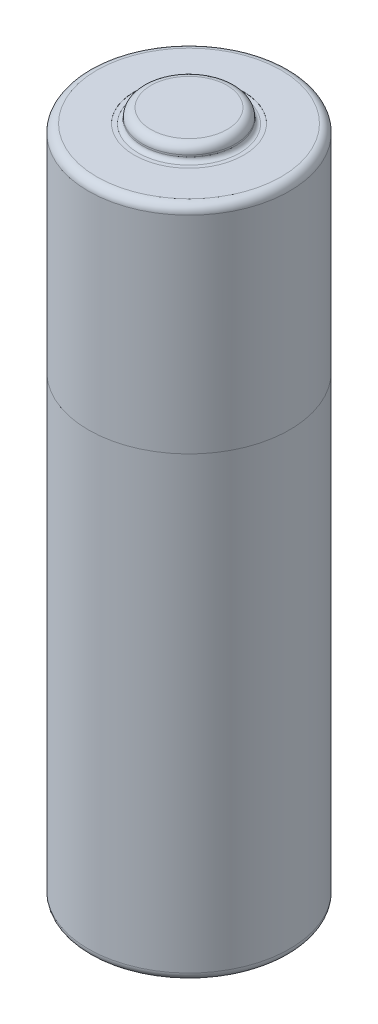
ISO-10303-21;
HEADER;
FILE_DESCRIPTION(('STEP AP214'),'2;1');
FILE_NAME('part.step','',(''),(''),'','','');
FILE_SCHEMA(('AUTOMOTIVE_DESIGN { 1 0 10303 214 1 1 1 1 }'));
ENDSEC;
DATA;
#1=APPLICATION_CONTEXT('core data for automotive mechanical design processes');
#2=APPLICATION_PROTOCOL_DEFINITION('international standard','automotive_design',2000,#1);
#3=PRODUCT_CONTEXT('',#1,'mechanical');
#4=PRODUCT('Part','Part','',(#3));
#5=PRODUCT_RELATED_PRODUCT_CATEGORY('part','',(#4));
#6=PRODUCT_DEFINITION_FORMATION('','',#4);
#7=PRODUCT_DEFINITION_CONTEXT('part definition',#1,'design');
#8=PRODUCT_DEFINITION('design','',#6,#7);
#9=PRODUCT_DEFINITION_SHAPE('','',#8);
#10=(LENGTH_UNIT() NAMED_UNIT(*) SI_UNIT(.MILLI.,.METRE.));
#11=(NAMED_UNIT(*) PLANE_ANGLE_UNIT() SI_UNIT($,.RADIAN.));
#12=(NAMED_UNIT(*) SI_UNIT($,.STERADIAN.) SOLID_ANGLE_UNIT());
#13=UNCERTAINTY_MEASURE_WITH_UNIT(LENGTH_MEASURE(1.E-05),#10,'distance_accuracy_value','');
#14=(GEOMETRIC_REPRESENTATION_CONTEXT(3) GLOBAL_UNCERTAINTY_ASSIGNED_CONTEXT((#13)) GLOBAL_UNIT_ASSIGNED_CONTEXT((#10,
#11,#12)) REPRESENTATION_CONTEXT('',''));
#15=CARTESIAN_POINT('',(0.,0.,0.));
#16=DIRECTION('',(0.,0.,1.));
#17=DIRECTION('',(1.,0.,0.));
#18=AXIS2_PLACEMENT_3D('',#15,#16,#17);
#19=CARTESIAN_POINT('',(0.,49.2500000000012,0.));
#20=DIRECTION('',(0.,-1.,0.));
#21=DIRECTION('',(1.,0.,0.));
#22=AXIS2_PLACEMENT_3D('',#19,#20,#21);
#23=PLANE('',#22);
#24=CARTESIAN_POINT('',(0.,49.2500000000012,2.9316826744008E-13));
#25=DIRECTION('',(0.,-1.,0.));
#26=DIRECTION('',(0.,0.,1.));
#27=AXIS2_PLACEMENT_3D('',#24,#25,#26);
#28=CIRCLE('',#27,2.74999999999971);
#29=CARTESIAN_POINT('',(0.,49.2500000000012,2.7500000000002));
#30=VERTEX_POINT('',#29);
#31=CARTESIAN_POINT('',(0.,49.2500000000012,-2.74999999999985));
#32=VERTEX_POINT('',#31);
#33=EDGE_CURVE('E112',#30,#32,#28,.T.);
#34=ORIENTED_EDGE('',*,*,#33,.F.);
#35=CARTESIAN_POINT('',(0.,49.2500000000012,2.9316826744008E-13));
#36=DIRECTION('',(0.,-1.,0.));
#37=DIRECTION('',(0.,0.,-1.));
#38=AXIS2_PLACEMENT_3D('',#35,#36,#37);
#39=CIRCLE('',#38,2.7500000000003);
#40=EDGE_CURVE('E116',#32,#30,#39,.T.);
#41=ORIENTED_EDGE('',*,*,#40,.F.);
#42=EDGE_LOOP('',(#34,#41));
#43=FACE_BOUND('',#42,.T.);
#44=ADVANCED_FACE('F24',(#43),#23,.F.);
#45=CARTESIAN_POINT('',(0.,48.6500000000012,2.9316826744008E-13));
#46=DIRECTION('',(0.,1.,0.));
#47=DIRECTION('',(0.,0.,1.));
#48=AXIS2_PLACEMENT_3D('',#45,#46,#47);
#49=TOROIDAL_SURFACE('',#48,2.75,0.6);
#50=ORIENTED_EDGE('',*,*,#33,.T.);
#51=ORIENTED_EDGE('',*,*,#40,.T.);
#52=EDGE_LOOP('',(#50,#51));
#53=FACE_BOUND('',#52,.T.);
#54=CARTESIAN_POINT('',(0.,48.6500000000012,0.));
#55=DIRECTION('',(0.,1.,0.));
#56=DIRECTION('',(-1.,0.,0.));
#57=AXIS2_PLACEMENT_3D('',#54,#55,#56);
#58=CIRCLE('',#57,3.35);
#59=CARTESIAN_POINT('',(-3.35000000000003,48.6500000000012,0.));
#60=VERTEX_POINT('',#59);
#61=EDGE_CURVE('E125',#60,#60,#58,.F.);
#62=ORIENTED_EDGE('',*,*,#61,.F.);
#63=EDGE_LOOP('',(#62));
#64=FACE_BOUND('',#63,.T.);
#65=ADVANCED_FACE('F122',(#53,#64),#49,.T.);
#66=CARTESIAN_POINT('',(0.,-1.00000000000008,2.9316826744008E-13));
#67=DIRECTION('',(0.,1.,0.));
#68=DIRECTION('',(-1.,0.,0.));
#69=AXIS2_PLACEMENT_3D('',#66,#67,#68);
#70=PLANE('',#69);
#71=CARTESIAN_POINT('',(0.,-1.00000000000007,2.89698820488127E-13));
#72=DIRECTION('',(0.,1.,0.));
#73=DIRECTION('',(0.,0.,-1.));
#74=AXIS2_PLACEMENT_3D('',#71,#72,#73);
#75=CIRCLE('',#74,3.95);
#76=CARTESIAN_POINT('',(0.,-1.00000000000007,-3.94999999999971));
#77=VERTEX_POINT('',#76);
#78=CARTESIAN_POINT('',(0.,-1.00000000000007,3.95000000000029));
#79=VERTEX_POINT('',#78);
#80=EDGE_CURVE('E150',#77,#79,#75,.T.);
#81=ORIENTED_EDGE('',*,*,#80,.F.);
#82=CARTESIAN_POINT('',(0.,-1.00000000000007,2.89698820488127E-13));
#83=DIRECTION('',(0.,1.,0.));
#84=DIRECTION('',(0.,0.,1.));
#85=AXIS2_PLACEMENT_3D('',#82,#83,#84);
#86=CIRCLE('',#85,3.95);
#87=EDGE_CURVE('E183',#79,#77,#86,.T.);
#88=ORIENTED_EDGE('',*,*,#87,.F.);
#89=EDGE_LOOP('',(#81,#88));
#90=FACE_BOUND('',#89,.T.);
#91=ADVANCED_FACE('F141',(#90),#70,.F.);
#92=CARTESIAN_POINT('',(0.,7.58183489262092,0.));
#93=DIRECTION('',(0.,1.,0.));
#94=DIRECTION('',(-1.,0.,0.));
#95=AXIS2_PLACEMENT_3D('',#92,#93,#94);
#96=CYLINDRICAL_SURFACE('',#95,3.35);
#97=ORIENTED_EDGE('',*,*,#61,.T.);
#98=EDGE_LOOP('',(#97));
#99=FACE_BOUND('',#98,.T.);
#100=CARTESIAN_POINT('',(0.,48.5300000000012,2.9316826744008E-13));
#101=DIRECTION('',(0.,1.,0.));
#102=DIRECTION('',(0.,0.,1.));
#103=AXIS2_PLACEMENT_3D('',#100,#101,#102);
#104=CIRCLE('',#103,3.35);
#105=CARTESIAN_POINT('',(0.,48.5300000000012,3.35000000000029));
#106=VERTEX_POINT('',#105);
#107=EDGE_CURVE('E179',#106,#106,#104,.T.);
#108=ORIENTED_EDGE('',*,*,#107,.T.);
#109=EDGE_LOOP('',(#108));
#110=FACE_BOUND('',#109,.T.);
#111=ADVANCED_FACE('F168',(#99,#110),#96,.T.);
#112=CARTESIAN_POINT('',(0.,-0.700000000000069,2.89698820488127E-13));
#113=DIRECTION('',(0.,1.,0.));
#114=DIRECTION('',(0.,0.,1.));
#115=AXIS2_PLACEMENT_3D('',#112,#113,#114);
#116=TOROIDAL_SURFACE('',#115,3.95,0.3);
#117=CARTESIAN_POINT('',(0.,-0.700000000000069,0.));
#118=DIRECTION('',(0.,1.,0.));
#119=DIRECTION('',(-1.,0.,0.));
#120=AXIS2_PLACEMENT_3D('',#117,#118,#119);
#121=CIRCLE('',#120,4.25);
#122=CARTESIAN_POINT('',(-4.25000000000003,-0.700000000000069,0.));
#123=VERTEX_POINT('',#122);
#124=EDGE_CURVE('E177',#123,#123,#121,.T.);
#125=ORIENTED_EDGE('',*,*,#124,.F.);
#126=EDGE_LOOP('',(#125));
#127=FACE_BOUND('',#126,.T.);
#128=ORIENTED_EDGE('',*,*,#87,.T.);
#129=ORIENTED_EDGE('',*,*,#80,.T.);
#130=EDGE_LOOP('',(#128,#129));
#131=FACE_BOUND('',#130,.T.);
#132=ADVANCED_FACE('F157',(#127,#131),#116,.T.);
#133=CARTESIAN_POINT('',(0.,48.5300000000012,2.9316826744008E-13));
#134=DIRECTION('',(0.,1.,0.));
#135=DIRECTION('',(0.,0.,1.));
#136=AXIS2_PLACEMENT_3D('',#133,#134,#135);
#137=TOROIDAL_SURFACE('',#136,3.65,0.3);
#138=ORIENTED_EDGE('',*,*,#107,.F.);
#139=EDGE_LOOP('',(#138));
#140=FACE_BOUND('',#139,.T.);
#141=CARTESIAN_POINT('',(0.,48.2300000000012,2.9316826744008E-13));
#142=DIRECTION('',(0.,1.,0.));
#143=DIRECTION('',(0.,0.,-1.));
#144=AXIS2_PLACEMENT_3D('',#141,#142,#143);
#145=CIRCLE('',#144,3.65);
#146=CARTESIAN_POINT('',(0.,48.2300000000011,-3.64999999999971));
#147=VERTEX_POINT('',#146);
#148=CARTESIAN_POINT('',(0.,48.2300000000011,3.65000000000029));
#149=VERTEX_POINT('',#148);
#150=EDGE_CURVE('E226',#147,#149,#145,.T.);
#151=ORIENTED_EDGE('',*,*,#150,.T.);
#152=CARTESIAN_POINT('',(0.,48.2300000000012,2.9316826744008E-13));
#153=DIRECTION('',(0.,1.,0.));
#154=DIRECTION('',(0.,0.,1.));
#155=AXIS2_PLACEMENT_3D('',#152,#153,#154);
#156=CIRCLE('',#155,3.65);
#157=EDGE_CURVE('E280',#149,#147,#156,.T.);
#158=ORIENTED_EDGE('',*,*,#157,.T.);
#159=EDGE_LOOP('',(#151,#158));
#160=FACE_BOUND('',#159,.T.);
#161=ADVANCED_FACE('F167',(#140,#160),#137,.F.);
#162=CARTESIAN_POINT('',(0.,7.58183489262092,0.));
#163=DIRECTION('',(0.,1.,0.));
#164=DIRECTION('',(-1.,0.,0.));
#165=AXIS2_PLACEMENT_3D('',#162,#163,#164);
#166=CYLINDRICAL_SURFACE('',#165,4.25);
#167=CARTESIAN_POINT('',(0.,-0.540000000000006,2.89698820488127E-13));
#168=DIRECTION('',(0.,1.,0.));
#169=DIRECTION('',(0.,0.,1.));
#170=AXIS2_PLACEMENT_3D('',#167,#168,#169);
#171=CIRCLE('',#170,4.25);
#172=CARTESIAN_POINT('',(0.,-0.540000000000006,4.25000000000029));
#173=VERTEX_POINT('',#172);
#174=EDGE_CURVE('E317',#173,#173,#171,.F.);
#175=ORIENTED_EDGE('',*,*,#174,.T.);
#176=EDGE_LOOP('',(#175));
#177=FACE_BOUND('',#176,.T.);
#178=ORIENTED_EDGE('',*,*,#124,.T.);
#179=EDGE_LOOP('',(#178));
#180=FACE_BOUND('',#179,.T.);
#181=ADVANCED_FACE('F346',(#177,#180),#166,.T.);
#182=CARTESIAN_POINT('',(3.65,48.2300000000009,1.59594559789866E-13));
#183=DIRECTION('',(0.,-1.,0.));
#184=DIRECTION('',(1.,0.,0.));
#185=AXIS2_PLACEMENT_3D('',#182,#183,#184);
#186=PLANE('',#185);
#187=CARTESIAN_POINT('',(0.,48.2300000000009,-3.94999999999972));
#188=CARTESIAN_POINT('',(-0.753704577886863,48.2300000000009,-3.94999999999972));
#189=CARTESIAN_POINT('',(-1.45397410276946,48.2300000000009,-3.67266378919631));
#190=CARTESIAN_POINT('',(-1.8267741380189,48.2300000000009,-3.52501928163218));
#191=CARTESIAN_POINT('',(-2.16147852587137,48.2300000000009,-3.30613226931338));
#192=CARTESIAN_POINT('',(-2.50425783462435,48.2300000000009,-3.08196449171402));
#193=CARTESIAN_POINT('',(-2.79307178568692,48.2300000000009,-2.79307178568657));
#194=CARTESIAN_POINT('',(-3.08264307283529,48.2300000000009,-2.50342153705983));
#195=CARTESIAN_POINT('',(-3.30613226931373,48.2300000000009,-2.16147852587102));
#196=CARTESIAN_POINT('',(-3.52550285001301,48.2300000000009,-1.82583708050126));
#197=CARTESIAN_POINT('',(-3.67266378919665,48.2300000000009,-1.4539741027691));
#198=CARTESIAN_POINT('',(-3.95010109244425,48.2300000000009,-0.752914009704023));
#199=CARTESIAN_POINT('',(-3.95000000000005,48.2300000000009,2.98372437868011E-13));
#200=CARTESIAN_POINT('',(-3.94989876708713,48.2300000000009,0.753960189382939));
#201=CARTESIAN_POINT('',(-3.67266378919664,48.2300000000009,1.4539741027697));
#202=CARTESIAN_POINT('',(-3.52501928163427,48.2300000000009,1.82677413801496));
#203=CARTESIAN_POINT('',(-3.30613226931371,48.2300000000009,2.16147852587161));
#204=CARTESIAN_POINT('',(-3.0819644917163,48.2300000000009,2.50425783462313));
#205=CARTESIAN_POINT('',(-2.7930717856869,48.2300000000009,2.79307178568716));
#206=CARTESIAN_POINT('',(-2.50342153705905,48.2300000000009,3.08264307283614));
#207=CARTESIAN_POINT('',(-2.16147852587134,48.2300000000009,3.30613226931397));
#208=CARTESIAN_POINT('',(-1.82583708050135,48.2300000000009,3.52550285001351));
#209=CARTESIAN_POINT('',(-1.45397410276942,48.2300000000009,3.67266378919689));
#210=CARTESIAN_POINT('',(-0.753169461575054,48.2300000000009,3.95000000000028));
#211=CARTESIAN_POINT('',(0.,48.2300000000009,3.95000000000028));
#212=B_SPLINE_CURVE_WITH_KNOTS('',2,(#187,#188,#189,#190,#191,#192,#193,#194,#195,#196,#197,
#198,#199,#200,#201,#202,#203,#204,#205,#206,#207,#208,#209,#210,#211),.UNSPECIFIED.,.F.,.F.,(3,
2,2,2,2,2,2,2,2,2,2,2,3),(0.,0.125,0.1875,0.25,0.3125,0.375,0.5,0.625,0.6875,0.75,0.8125,0.875,
1.),.UNSPECIFIED.);
#213=CARTESIAN_POINT('',(0.,48.2300000000011,-3.94999999999989));
#214=VERTEX_POINT('',#213);
#215=CARTESIAN_POINT('',(0.,48.2300000000011,3.95000000000011));
#216=VERTEX_POINT('',#215);
#217=EDGE_CURVE('E292',#214,#216,#212,.T.);
#218=ORIENTED_EDGE('',*,*,#217,.T.);
#219=CARTESIAN_POINT('',(0.,48.2300000000009,3.95000000000028));
#220=CARTESIAN_POINT('',(0.753704577886354,48.2300000000009,3.95000000000028));
#221=CARTESIAN_POINT('',(1.45397410276937,48.2300000000009,3.67266378919688));
#222=CARTESIAN_POINT('',(1.82677413801696,48.2300000000009,3.52501928163357));
#223=CARTESIAN_POINT('',(2.16147852587129,48.2300000000009,3.30613226931394));
#224=CARTESIAN_POINT('',(2.50425783462454,48.2300000000009,3.0819644917148));
#225=CARTESIAN_POINT('',(2.79307178568683,48.2300000000009,2.79307178568713));
#226=CARTESIAN_POINT('',(3.08264307283677,48.2300000000009,2.50342153705833));
#227=CARTESIAN_POINT('',(3.30613226931364,48.2300000000009,2.16147852587158));
#228=CARTESIAN_POINT('',(3.52550285001381,48.2300000000009,1.82583708050013));
#229=CARTESIAN_POINT('',(3.67266378919656,48.2300000000009,1.45397410276966));
#230=CARTESIAN_POINT('',(3.95010109244539,48.2300000000009,0.752914009700439));
#231=CARTESIAN_POINT('',(3.94999999999996,48.2300000000009,2.65412691824451E-13));
#232=CARTESIAN_POINT('',(3.94989876708581,48.2300000000009,-0.753960189384605));
#233=CARTESIAN_POINT('',(3.67266378919655,48.2300000000009,-1.45397410276913));
#234=CARTESIAN_POINT('',(3.52501928163398,48.2300000000009,-1.82677413801535));
#235=CARTESIAN_POINT('',(3.30613226931362,48.2300000000009,-2.16147852587104));
#236=CARTESIAN_POINT('',(3.0819644917168,48.2300000000009,-2.50425783462099));
#237=CARTESIAN_POINT('',(2.79307178568681,48.2300000000009,-2.79307178568659));
#238=CARTESIAN_POINT('',(2.5034215370607,48.2300000000009,-3.08264307283482));
#239=CARTESIAN_POINT('',(2.16147852587126,48.2300000000009,-3.3061322693134));
#240=CARTESIAN_POINT('',(1.82583708050071,48.2300000000009,-3.52550285001292));
#241=CARTESIAN_POINT('',(1.45397410276934,48.2300000000009,-3.67266378919632));
#242=CARTESIAN_POINT('',(0.753169461576079,48.2300000000009,-3.94999999999972));
#243=CARTESIAN_POINT('',(0.,48.2300000000009,-3.94999999999972));
#244=B_SPLINE_CURVE_WITH_KNOTS('',2,(#219,#220,#221,#222,#223,#224,#225,#226,#227,#228,#229,
#230,#231,#232,#233,#234,#235,#236,#237,#238,#239,#240,#241,#242,#243),.UNSPECIFIED.,.F.,.F.,(3,
2,2,2,2,2,2,2,2,2,2,2,3),(0.,0.125,0.1875,0.25,0.3125,0.375,0.5,0.625,0.6875,0.75,0.8125,0.875,
1.),.UNSPECIFIED.);
#245=EDGE_CURVE('E303',#216,#214,#244,.T.);
#246=ORIENTED_EDGE('',*,*,#245,.T.);
#247=EDGE_LOOP('',(#218,#246));
#248=FACE_BOUND('',#247,.T.);
#249=ORIENTED_EDGE('',*,*,#150,.F.);
#250=ORIENTED_EDGE('',*,*,#157,.F.);
#251=EDGE_LOOP('',(#249,#250));
#252=FACE_BOUND('',#251,.T.);
#253=ADVANCED_FACE('F245',(#248,#252),#186,.F.);
#254=CARTESIAN_POINT('',(0.,-0.540000000000006,2.89698820488127E-13));
#255=DIRECTION('',(0.,1.,0.));
#256=DIRECTION('',(0.,0.,1.));
#257=AXIS2_PLACEMENT_3D('',#254,#255,#256);
#258=TOROIDAL_SURFACE('',#257,4.55,0.3);
#259=CARTESIAN_POINT('',(0.,-0.240000000000006,2.89698820488127E-13));
#260=DIRECTION('',(0.,-1.,0.));
#261=DIRECTION('',(0.,0.,-1.));
#262=AXIS2_PLACEMENT_3D('',#259,#260,#261);
#263=CIRCLE('',#262,4.54999999999993);
#264=CARTESIAN_POINT('',(0.,-0.240000000000019,-4.54999999999975));
#265=VERTEX_POINT('',#264);
#266=CARTESIAN_POINT('',(0.,-0.240000000000019,4.55000000000022));
#267=VERTEX_POINT('',#266);
#268=EDGE_CURVE('E259',#265,#267,#263,.T.);
#269=ORIENTED_EDGE('',*,*,#268,.T.);
#270=CARTESIAN_POINT('',(0.,-0.240000000000006,2.89698820488127E-13));
#271=DIRECTION('',(0.,-1.,0.));
#272=DIRECTION('',(0.,0.,1.));
#273=AXIS2_PLACEMENT_3D('',#270,#271,#272);
#274=CIRCLE('',#273,4.55000000000007);
#275=EDGE_CURVE('E505',#267,#265,#274,.T.);
#276=ORIENTED_EDGE('',*,*,#275,.T.);
#277=EDGE_LOOP('',(#269,#276));
#278=FACE_BOUND('',#277,.T.);
#279=ORIENTED_EDGE('',*,*,#174,.F.);
#280=EDGE_LOOP('',(#279));
#281=FACE_BOUND('',#280,.T.);
#282=ADVANCED_FACE('F233',(#278,#281),#258,.F.);
#283=CARTESIAN_POINT('',(0.,7.58183489262092,0.));
#284=DIRECTION('',(0.,1.,0.));
#285=DIRECTION('',(-1.,0.,0.));
#286=AXIS2_PLACEMENT_3D('',#283,#284,#285);
#287=CYLINDRICAL_SURFACE('',#286,3.95);
#288=ORIENTED_EDGE('',*,*,#245,.F.);
#289=ORIENTED_EDGE('',*,*,#217,.F.);
#290=EDGE_LOOP('',(#288,#289));
#291=FACE_BOUND('',#290,.T.);
#292=CARTESIAN_POINT('',(0.,48.2500000000012,0.));
#293=DIRECTION('',(0.,1.,0.));
#294=DIRECTION('',(0.,0.,-1.));
#295=AXIS2_PLACEMENT_3D('',#292,#293,#294);
#296=CIRCLE('',#295,3.95);
#297=CARTESIAN_POINT('',(0.,48.2500000000011,-3.94999999999989));
#298=VERTEX_POINT('',#297);
#299=CARTESIAN_POINT('',(0.,48.2500000000011,3.95000000000011));
#300=VERTEX_POINT('',#299);
#301=EDGE_CURVE('E487',#298,#300,#296,.T.);
#302=ORIENTED_EDGE('',*,*,#301,.T.);
#303=CARTESIAN_POINT('',(0.,48.2500000000012,0.));
#304=DIRECTION('',(0.,1.,0.));
#305=DIRECTION('',(0.,0.,1.));
#306=AXIS2_PLACEMENT_3D('',#303,#304,#305);
#307=CIRCLE('',#306,3.95);
#308=EDGE_CURVE('E506',#300,#298,#307,.T.);
#309=ORIENTED_EDGE('',*,*,#308,.T.);
#310=EDGE_LOOP('',(#302,#309));
#311=FACE_BOUND('',#310,.T.);
#312=ADVANCED_FACE('F244',(#291,#311),#287,.F.);
#313=CARTESIAN_POINT('',(4.55,-0.240000000000039,-1.21430643318376E-13));
#314=DIRECTION('',(0.,1.,0.));
#315=DIRECTION('',(-1.,0.,0.));
#316=AXIS2_PLACEMENT_3D('',#313,#314,#315);
#317=PLANE('',#316);
#318=ORIENTED_EDGE('',*,*,#275,.F.);
#319=ORIENTED_EDGE('',*,*,#268,.F.);
#320=EDGE_LOOP('',(#318,#319));
#321=FACE_BOUND('',#320,.T.);
#322=CARTESIAN_POINT('',(0.,-0.240000000000039,6.29770850189359));
#323=CARTESIAN_POINT('',(-0.578064736426032,-0.240000000000039,6.29770850189359));
#324=CARTESIAN_POINT('',(-1.14595026220642,-0.240000000000039,6.19257057863467));
#325=CARTESIAN_POINT('',(-1.74895183396519,-0.240000000000039,6.08093129554244));
#326=CARTESIAN_POINT('',(-2.31815318190981,-0.240000000000039,5.85553568856208));
#327=CARTESIAN_POINT('',(-2.91225093025682,-0.240000000000039,5.62028146248218));
#328=CARTESIAN_POINT('',(-3.44616751621266,-0.240000000000039,5.2711537470485));
#329=CARTESIAN_POINT('',(-3.99243147882217,-0.240000000000039,4.91395208988666));
#330=CARTESIAN_POINT('',(-4.45315238762509,-0.240000000000039,4.45315238762516));
#331=CARTESIAN_POINT('',(-4.9146306710089,-0.240000000000039,3.99159518125498));
#332=CARTESIAN_POINT('',(-5.27115374704844,-0.240000000000039,3.44616751621274));
#333=CARTESIAN_POINT('',(-5.62076503086097,-0.240000000000039,2.91131387273878));
#334=CARTESIAN_POINT('',(-5.85553568856203,-0.240000000000039,2.3181531819099));
#335=CARTESIAN_POINT('',(-6.08122265092494,-0.240000000000039,1.74794293580362));
#336=CARTESIAN_POINT('',(-6.19257057863465,-0.240000000000039,1.14595026220652));
#337=CARTESIAN_POINT('',(-6.29775711538334,-0.240000000000039,0.577268601162514));
#338=CARTESIAN_POINT('',(-6.29770850189358,-0.240000000000039,0.));
#339=CARTESIAN_POINT('',(-6.29765979920589,-0.240000000000039,-0.578327796136489));
#340=CARTESIAN_POINT('',(-6.19257057863467,-0.240000000000039,-1.14595026220642));
#341=CARTESIAN_POINT('',(-6.08093129554121,-0.240000000000039,-1.74895183396933));
#342=CARTESIAN_POINT('',(-5.85553568856208,-0.240000000000039,-2.3181531819098));
#343=CARTESIAN_POINT('',(-5.62028146248187,-0.240000000000039,-2.91225093025653));
#344=CARTESIAN_POINT('',(-5.2711537470485,-0.240000000000039,-3.44616751621265));
#345=CARTESIAN_POINT('',(-4.91395208989014,-0.240000000000039,-3.99243147881765));
#346=CARTESIAN_POINT('',(-4.45315238762517,-0.240000000000039,-4.45315238762509));
#347=CARTESIAN_POINT('',(-3.99159518125728,-0.240000000000039,-4.91463067100765));
#348=CARTESIAN_POINT('',(-3.44616751621276,-0.240000000000039,-5.27115374704843));
#349=CARTESIAN_POINT('',(-2.91131387273083,-0.240000000000039,-5.62076503086594));
#350=CARTESIAN_POINT('',(-2.31815318190992,-0.240000000000039,-5.85553568856204));
#351=CARTESIAN_POINT('',(-1.74794293579301,-0.240000000000039,-6.08122265092742));
#352=CARTESIAN_POINT('',(-1.14595026220654,-0.240000000000039,-6.19257057863466));
#353=CARTESIAN_POINT('',(-0.577531425671142,-0.240000000000039,-6.29770850189359));
#354=CARTESIAN_POINT('',(0.,-0.240000000000039,-6.29770850189359));
#355=B_SPLINE_CURVE_WITH_KNOTS('',2,(#322,#323,#324,#325,#326,#327,#328,#329,#330,#331,#332,
#333,#334,#335,#336,#337,#338,#339,#340,#341,#342,#343,#344,#345,#346,#347,#348,#349,#350,#351,
#352,#353,#354),.UNSPECIFIED.,.F.,.F.,(3,2,2,2,2,2,2,2,2,2,2,2,2,2,2,2,3),(0.,0.0625,0.125,
0.1875,0.25,0.3125,0.375,0.4375,0.5,0.5625,0.625,0.6875,0.75,0.8125,0.875,0.9375,1.),.UNSPECIFIED.);
#356=CARTESIAN_POINT('',(0.,-0.240000000000013,6.29770850189358));
#357=VERTEX_POINT('',#356);
#358=CARTESIAN_POINT('',(0.,-0.240000000000013,-6.2977085018936));
#359=VERTEX_POINT('',#358);
#360=EDGE_CURVE('E462',#357,#359,#355,.T.);
#361=ORIENTED_EDGE('',*,*,#360,.T.);
#362=CARTESIAN_POINT('',(0.,-0.240000000000039,-6.29770850189359));
#363=CARTESIAN_POINT('',(0.578064736425724,-0.240000000000039,-6.29770850189359));
#364=CARTESIAN_POINT('',(1.1459502622064,-0.240000000000039,-6.19257057863469));
#365=CARTESIAN_POINT('',(1.74895183396743,-0.240000000000039,-6.0809312955421));
#366=CARTESIAN_POINT('',(2.3181531819098,-0.240000000000039,-5.8555356885621));
#367=CARTESIAN_POINT('',(2.91225093025877,-0.240000000000039,-5.62028146248087));
#368=CARTESIAN_POINT('',(3.44616751621266,-0.240000000000039,-5.27115374704851));
#369=CARTESIAN_POINT('',(3.99243147882505,-0.240000000000039,-4.91395208988486));
#370=CARTESIAN_POINT('',(4.45315238762509,-0.240000000000039,-4.45315238762518));
#371=CARTESIAN_POINT('',(4.91463067101009,-0.240000000000039,-3.99159518125275));
#372=CARTESIAN_POINT('',(5.27115374704845,-0.240000000000039,-3.44616751621277));
#373=CARTESIAN_POINT('',(5.62076503086541,-0.240000000000039,-2.91131387273245));
#374=CARTESIAN_POINT('',(5.85553568856205,-0.240000000000039,-2.31815318190992));
#375=CARTESIAN_POINT('',(6.08122265092576,-0.240000000000039,-1.74794293579697));
#376=CARTESIAN_POINT('',(6.19257057863467,-0.240000000000039,-1.14595026220654));
#377=CARTESIAN_POINT('',(6.29775711538289,-0.240000000000039,-0.577268601167271));
#378=CARTESIAN_POINT('',(6.2977085018936,-0.240000000000039,0.));
#379=CARTESIAN_POINT('',(6.29765979920638,-0.240000000000039,0.578327796128603));
#380=CARTESIAN_POINT('',(6.19257057863469,-0.240000000000039,1.14595026220641));
#381=CARTESIAN_POINT('',(6.08093129554364,-0.240000000000039,1.748951833962));
#382=CARTESIAN_POINT('',(5.8555356885621,-0.240000000000039,2.3181531819098));
#383=CARTESIAN_POINT('',(5.62028146248331,-0.240000000000039,2.91225093025425));
#384=CARTESIAN_POINT('',(5.27115374704851,-0.240000000000039,3.44616751621266));
#385=CARTESIAN_POINT('',(4.91395208988739,-0.240000000000039,3.99243147882199));
#386=CARTESIAN_POINT('',(4.45315238762517,-0.240000000000039,4.45315238762509));
#387=CARTESIAN_POINT('',(3.99159518125528,-0.240000000000039,4.91463067100808));
#388=CARTESIAN_POINT('',(3.44616751621275,-0.240000000000039,5.27115374704844));
#389=CARTESIAN_POINT('',(2.91131387273839,-0.240000000000039,5.62076503086186));
#390=CARTESIAN_POINT('',(2.31815318190991,-0.240000000000039,5.85553568856205));
#391=CARTESIAN_POINT('',(1.74794293579404,-0.240000000000039,6.08122265092805));
#392=CARTESIAN_POINT('',(1.14595026220652,-0.240000000000039,6.19257057863466));
#393=CARTESIAN_POINT('',(0.577531425666942,-0.240000000000039,6.29770850189359));
#394=CARTESIAN_POINT('',(0.,-0.240000000000039,6.29770850189359));
#395=B_SPLINE_CURVE_WITH_KNOTS('',2,(#362,#363,#364,#365,#366,#367,#368,#369,#370,#371,#372,
#373,#374,#375,#376,#377,#378,#379,#380,#381,#382,#383,#384,#385,#386,#387,#388,#389,#390,#391,
#392,#393,#394),.UNSPECIFIED.,.F.,.F.,(3,2,2,2,2,2,2,2,2,2,2,2,2,2,2,2,3),(0.,0.0625,0.125,
0.1875,0.25,0.3125,0.375,0.4375,0.5,0.5625,0.625,0.6875,0.75,0.8125,0.875,0.9375,1.),.UNSPECIFIED.);
#396=EDGE_CURVE('E507',#359,#357,#395,.T.);
#397=ORIENTED_EDGE('',*,*,#396,.T.);
#398=EDGE_LOOP('',(#361,#397));
#399=FACE_BOUND('',#398,.T.);
#400=ADVANCED_FACE('F650',(#321,#399),#317,.F.);
#401=CARTESIAN_POINT('',(6.65000000000009,48.2500000000009,3.22658566531686E-13));
#402=DIRECTION('',(0.,-1.,0.));
#403=DIRECTION('',(1.,0.,0.));
#404=AXIS2_PLACEMENT_3D('',#401,#402,#403);
#405=PLANE('',#404);
#406=CARTESIAN_POINT('',(0.,48.2500000000012,0.));
#407=DIRECTION('',(0.,-1.,0.));
#408=DIRECTION('',(0.,0.,1.));
#409=AXIS2_PLACEMENT_3D('',#406,#407,#408);
#410=CIRCLE('',#409,6.65000000000029);
#411=CARTESIAN_POINT('',(0.,48.2500000000011,6.65000000000008));
#412=VERTEX_POINT('',#411);
#413=CARTESIAN_POINT('',(0.,48.2500000000011,-6.64999999999986));
#414=VERTEX_POINT('',#413);
#415=EDGE_CURVE('E509',#412,#414,#410,.T.);
#416=ORIENTED_EDGE('',*,*,#415,.F.);
#417=CARTESIAN_POINT('',(0.,48.2500000000012,0.));
#418=DIRECTION('',(0.,-1.,0.));
#419=DIRECTION('',(0.,0.,-1.));
#420=AXIS2_PLACEMENT_3D('',#417,#418,#419);
#421=CIRCLE('',#420,6.64999999999971);
#422=EDGE_CURVE('E511',#414,#412,#421,.T.);
#423=ORIENTED_EDGE('',*,*,#422,.F.);
#424=EDGE_LOOP('',(#416,#423));
#425=FACE_BOUND('',#424,.T.);
#426=ORIENTED_EDGE('',*,*,#301,.F.);
#427=ORIENTED_EDGE('',*,*,#308,.F.);
#428=EDGE_LOOP('',(#426,#427));
#429=FACE_BOUND('',#428,.T.);
#430=ADVANCED_FACE('F645',(#425,#429),#405,.F.);
#431=CARTESIAN_POINT('',(0.,7.58183489262092,0.));
#432=DIRECTION('',(0.,1.,0.));
#433=DIRECTION('',(-1.,0.,0.));
#434=AXIS2_PLACEMENT_3D('',#431,#432,#433);
#435=CYLINDRICAL_SURFACE('',#434,6.29770850189359);
#436=CARTESIAN_POINT('',(0.,-0.249999999999999,0.));
#437=DIRECTION('',(0.,-1.,0.));
#438=DIRECTION('',(0.,0.,-1.));
#439=AXIS2_PLACEMENT_3D('',#436,#437,#438);
#440=CIRCLE('',#439,6.29770850189359);
#441=CARTESIAN_POINT('',(0.,-0.250000000000008,-6.2977085018936));
#442=VERTEX_POINT('',#441);
#443=CARTESIAN_POINT('',(0.,-0.250000000000008,6.29770850189358));
#444=VERTEX_POINT('',#443);
#445=EDGE_CURVE('E419',#442,#444,#440,.T.);
#446=ORIENTED_EDGE('',*,*,#445,.T.);
#447=CARTESIAN_POINT('',(0.,-0.249999999999999,0.));
#448=DIRECTION('',(0.,-1.,0.));
#449=DIRECTION('',(0.,0.,1.));
#450=AXIS2_PLACEMENT_3D('',#447,#448,#449);
#451=CIRCLE('',#450,6.29770850189359);
#452=EDGE_CURVE('E474',#444,#442,#451,.T.);
#453=ORIENTED_EDGE('',*,*,#452,.T.);
#454=EDGE_LOOP('',(#446,#453));
#455=FACE_BOUND('',#454,.T.);
#456=ORIENTED_EDGE('',*,*,#360,.F.);
#457=ORIENTED_EDGE('',*,*,#396,.F.);
#458=EDGE_LOOP('',(#456,#457));
#459=FACE_BOUND('',#458,.T.);
#460=ADVANCED_FACE('F435',(#455,#459),#435,.F.);
#461=CARTESIAN_POINT('',(0.,47.6500000000012,0.));
#462=DIRECTION('',(0.,1.,0.));
#463=DIRECTION('',(0.,0.,1.));
#464=AXIS2_PLACEMENT_3D('',#461,#462,#463);
#465=TOROIDAL_SURFACE('',#464,6.65,0.6);
#466=ORIENTED_EDGE('',*,*,#415,.T.);
#467=ORIENTED_EDGE('',*,*,#422,.T.);
#468=EDGE_LOOP('',(#466,#467));
#469=FACE_BOUND('',#468,.T.);
#470=CARTESIAN_POINT('',(0.,47.6500000000012,0.));
#471=DIRECTION('',(0.,1.,0.));
#472=DIRECTION('',(-1.,0.,0.));
#473=AXIS2_PLACEMENT_3D('',#470,#471,#472);
#474=CIRCLE('',#473,7.25);
#475=CARTESIAN_POINT('',(-7.25000000000003,47.6500000000012,0.));
#476=VERTEX_POINT('',#475);
#477=EDGE_CURVE('E406',#476,#476,#474,.F.);
#478=ORIENTED_EDGE('',*,*,#477,.F.);
#479=EDGE_LOOP('',(#478));
#480=FACE_BOUND('',#479,.T.);
#481=ADVANCED_FACE('F429',(#469,#480),#465,.T.);
#482=CARTESIAN_POINT('',(6.2977085018937,-0.250000000000021,0.));
#483=DIRECTION('',(0.,1.,0.));
#484=DIRECTION('',(-1.,0.,0.));
#485=AXIS2_PLACEMENT_3D('',#482,#483,#484);
#486=PLANE('',#485);
#487=ORIENTED_EDGE('',*,*,#452,.F.);
#488=ORIENTED_EDGE('',*,*,#445,.F.);
#489=EDGE_LOOP('',(#487,#488));
#490=FACE_BOUND('',#489,.T.);
#491=CARTESIAN_POINT('',(0.,-0.250000000000004,0.));
#492=DIRECTION('',(0.,1.,0.));
#493=DIRECTION('',(0.,0.,-1.));
#494=AXIS2_PLACEMENT_3D('',#491,#492,#493);
#495=CIRCLE('',#494,6.65);
#496=CARTESIAN_POINT('',(0.,-0.250000000000011,-6.65));
#497=VERTEX_POINT('',#496);
#498=CARTESIAN_POINT('',(0.,-0.250000000000011,6.65));
#499=VERTEX_POINT('',#498);
#500=EDGE_CURVE('E414',#497,#499,#495,.T.);
#501=ORIENTED_EDGE('',*,*,#500,.F.);
#502=CARTESIAN_POINT('',(0.,-0.250000000000004,0.));
#503=DIRECTION('',(0.,1.,0.));
#504=DIRECTION('',(0.,0.,1.));
#505=AXIS2_PLACEMENT_3D('',#502,#503,#504);
#506=CIRCLE('',#505,6.65);
#507=EDGE_CURVE('E402',#499,#497,#506,.T.);
#508=ORIENTED_EDGE('',*,*,#507,.F.);
#509=EDGE_LOOP('',(#501,#508));
#510=FACE_BOUND('',#509,.T.);
#511=ADVANCED_FACE('F434',(#490,#510),#486,.F.);
#512=CARTESIAN_POINT('',(0.,7.58183489262092,0.));
#513=DIRECTION('',(0.,1.,0.));
#514=DIRECTION('',(-1.,0.,0.));
#515=AXIS2_PLACEMENT_3D('',#512,#513,#514);
#516=CYLINDRICAL_SURFACE('',#515,7.25);
#517=ORIENTED_EDGE('',*,*,#477,.T.);
#518=EDGE_LOOP('',(#517));
#519=FACE_BOUND('',#518,.T.);
#520=CARTESIAN_POINT('',(0.,32.7500000000006,0.));
#521=DIRECTION('',(0.,-1.,0.));
#522=DIRECTION('',(0.,0.,-1.));
#523=AXIS2_PLACEMENT_3D('',#520,#521,#522);
#524=CIRCLE('',#523,7.2505);
#525=CARTESIAN_POINT('',(0.,32.7500000000006,-7.25025));
#526=VERTEX_POINT('',#525);
#527=CARTESIAN_POINT('',(0.,32.7500000000006,7.25024999999999));
#528=VERTEX_POINT('',#527);
#529=EDGE_CURVE('E389',#526,#528,#524,.T.);
#530=ORIENTED_EDGE('',*,*,#529,.F.);
#531=CARTESIAN_POINT('',(0.,32.7500000000006,0.));
#532=DIRECTION('',(0.,1.,0.));
#533=DIRECTION('',(0.,0.,-1.));
#534=AXIS2_PLACEMENT_3D('',#531,#532,#533);
#535=CIRCLE('',#534,7.25);
#536=EDGE_CURVE('E44',#526,#528,#535,.T.);
#537=ORIENTED_EDGE('',*,*,#536,.T.);
#538=EDGE_LOOP('',(#530,#537));
#539=FACE_BOUND('',#538,.T.);
#540=ADVANCED_FACE('F559',(#519,#539),#516,.T.);
#541=CARTESIAN_POINT('',(0.,0.349999999999996,0.));
#542=DIRECTION('',(0.,1.,0.));
#543=DIRECTION('',(0.,0.,1.));
#544=AXIS2_PLACEMENT_3D('',#541,#542,#543);
#545=TOROIDAL_SURFACE('',#544,6.65,0.6);
#546=CARTESIAN_POINT('',(0.,0.349999999999996,0.));
#547=DIRECTION('',(0.,-1.,0.));
#548=DIRECTION('',(0.,0.,1.));
#549=AXIS2_PLACEMENT_3D('',#546,#547,#548);
#550=CIRCLE('',#549,7.25);
#551=CARTESIAN_POINT('',(0.,0.349999999999996,-7.25025));
#552=VERTEX_POINT('',#551);
#553=CARTESIAN_POINT('',(0.,0.349999999999996,7.25025));
#554=VERTEX_POINT('',#553);
#555=EDGE_CURVE('E393',#552,#554,#550,.F.);
#556=ORIENTED_EDGE('',*,*,#555,.F.);
#557=CARTESIAN_POINT('',(0.,0.349999999999996,0.));
#558=DIRECTION('',(0.,-1.,0.));
#559=DIRECTION('',(0.,0.,-1.));
#560=AXIS2_PLACEMENT_3D('',#557,#558,#559);
#561=CIRCLE('',#560,7.25);
#562=EDGE_CURVE('E392',#554,#552,#561,.F.);
#563=ORIENTED_EDGE('',*,*,#562,.F.);
#564=EDGE_LOOP('',(#556,#563));
#565=FACE_BOUND('',#564,.T.);
#566=ORIENTED_EDGE('',*,*,#507,.T.);
#567=ORIENTED_EDGE('',*,*,#500,.T.);
#568=EDGE_LOOP('',(#566,#567));
#569=FACE_BOUND('',#568,.T.);
#570=ADVANCED_FACE('F567',(#565,#569),#545,.T.);
#571=CARTESIAN_POINT('',(0.,32.7500000000006,0.));
#572=DIRECTION('',(0.,-1.,0.));
#573=DIRECTION('',(1.,0.,0.));
#574=AXIS2_PLACEMENT_3D('',#571,#572,#573);
#575=PLANE('',#574);
#576=CARTESIAN_POINT('',(0.,32.7500000000006,0.));
#577=DIRECTION('',(0.,-1.,0.));
#578=DIRECTION('',(1.,0.,0.));
#579=AXIS2_PLACEMENT_3D('',#576,#577,#578);
#580=CIRCLE('',#579,7.2505);
#581=EDGE_CURVE('E36',#528,#526,#580,.T.);
#582=ORIENTED_EDGE('',*,*,#581,.F.);
#583=ORIENTED_EDGE('',*,*,#536,.F.);
#584=EDGE_LOOP('',(#582,#583));
#585=FACE_BOUND('',#584,.T.);
#586=ADVANCED_FACE('F363',(#585),#575,.F.);
#587=CARTESIAN_POINT('',(0.,0.349999999999996,0.));
#588=DIRECTION('',(0.,-1.,0.));
#589=DIRECTION('',(1.,0.,0.));
#590=AXIS2_PLACEMENT_3D('',#587,#588,#589);
#591=PLANE('',#590);
#592=ORIENTED_EDGE('',*,*,#555,.T.);
#593=CARTESIAN_POINT('',(0.,0.349999999999996,0.));
#594=DIRECTION('',(0.,-1.,0.));
#595=DIRECTION('',(1.,0.,0.));
#596=AXIS2_PLACEMENT_3D('',#593,#594,#595);
#597=CIRCLE('',#596,7.2505);
#598=EDGE_CURVE('E13',#552,#554,#597,.F.);
#599=ORIENTED_EDGE('',*,*,#598,.F.);
#600=EDGE_LOOP('',(#592,#599));
#601=FACE_BOUND('',#600,.T.);
#602=ADVANCED_FACE('F357',(#601),#591,.T.);
#603=CARTESIAN_POINT('',(0.,32.7500000000006,0.));
#604=DIRECTION('',(0.,-1.,0.));
#605=DIRECTION('',(1.,0.,0.));
#606=AXIS2_PLACEMENT_3D('',#603,#604,#605);
#607=CYLINDRICAL_SURFACE('',#606,7.2505);
#608=ORIENTED_EDGE('',*,*,#529,.T.);
#609=ORIENTED_EDGE('',*,*,#581,.T.);
#610=EDGE_LOOP('',(#608,#609));
#611=FACE_BOUND('',#610,.T.);
#612=ORIENTED_EDGE('',*,*,#562,.T.);
#613=ORIENTED_EDGE('',*,*,#598,.T.);
#614=EDGE_LOOP('',(#612,#613));
#615=FACE_BOUND('',#614,.T.);
#616=ADVANCED_FACE('F355',(#611,#615),#607,.T.);
#617=CLOSED_SHELL('',(#44,#65,#91,#111,#132,#161,#181,#253,#282,#312,#400,#430,#460,#481,#511,
#540,#570,#586,#602,#616));
#618=MANIFOLD_SOLID_BREP('B1',#617);
#619=ADVANCED_BREP_SHAPE_REPRESENTATION('',(#18,#618),#14);
#620=SHAPE_DEFINITION_REPRESENTATION(#9,#619);
ENDSEC;
END-ISO-10303-21;
